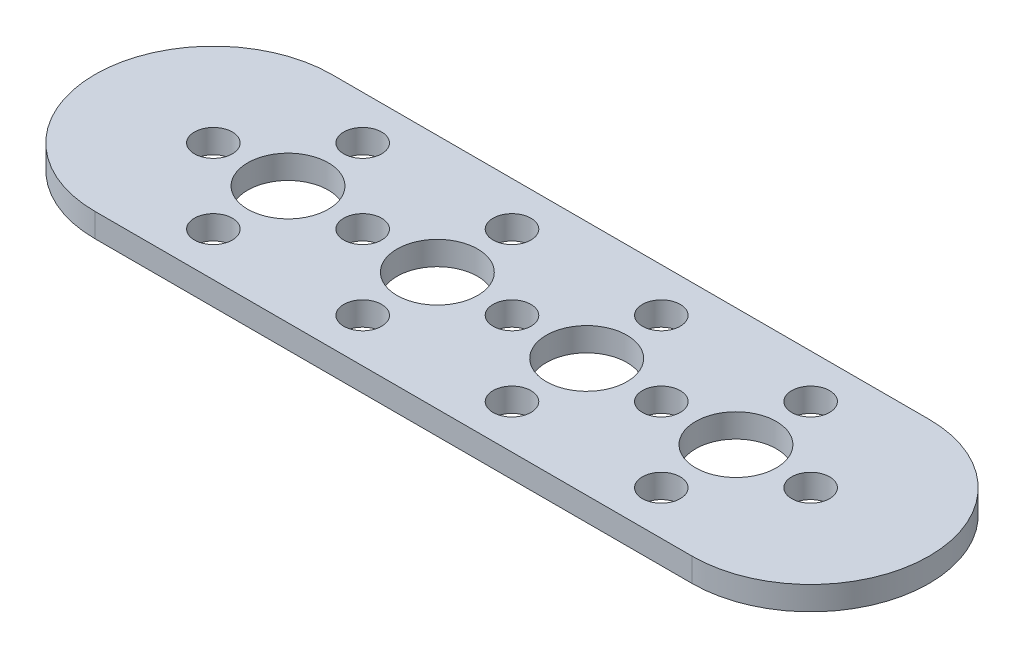
ISO-10303-21;
HEADER;
FILE_DESCRIPTION(('STEP AP214'),'2;1');
FILE_NAME('part.step','',(''),(''),'','','');
FILE_SCHEMA(('AUTOMOTIVE_DESIGN { 1 0 10303 214 1 1 1 1 }'));
ENDSEC;
DATA;
#1=APPLICATION_CONTEXT('core data for automotive mechanical design processes');
#2=APPLICATION_PROTOCOL_DEFINITION('international standard','automotive_design',2000,#1);
#3=PRODUCT_CONTEXT('',#1,'mechanical');
#4=PRODUCT('Part','Part','',(#3));
#5=PRODUCT_RELATED_PRODUCT_CATEGORY('part','',(#4));
#6=PRODUCT_DEFINITION_FORMATION('','',#4);
#7=PRODUCT_DEFINITION_CONTEXT('part definition',#1,'design');
#8=PRODUCT_DEFINITION('design','',#6,#7);
#9=PRODUCT_DEFINITION_SHAPE('','',#8);
#10=(LENGTH_UNIT() NAMED_UNIT(*) SI_UNIT(.MILLI.,.METRE.));
#11=(NAMED_UNIT(*) PLANE_ANGLE_UNIT() SI_UNIT($,.RADIAN.));
#12=(NAMED_UNIT(*) SI_UNIT($,.STERADIAN.) SOLID_ANGLE_UNIT());
#13=UNCERTAINTY_MEASURE_WITH_UNIT(LENGTH_MEASURE(1.E-05),#10,'distance_accuracy_value','');
#14=(GEOMETRIC_REPRESENTATION_CONTEXT(3) GLOBAL_UNCERTAINTY_ASSIGNED_CONTEXT((#13)) GLOBAL_UNIT_ASSIGNED_CONTEXT((#10,
#11,#12)) REPRESENTATION_CONTEXT('',''));
#15=CARTESIAN_POINT('',(0.,0.,0.));
#16=DIRECTION('',(0.,0.,1.));
#17=DIRECTION('',(1.,0.,0.));
#18=AXIS2_PLACEMENT_3D('',#15,#16,#17);
#19=CARTESIAN_POINT('',(56.007,2.54,0.));
#20=DIRECTION('',(0.,-1.,0.));
#21=DIRECTION('',(0.,0.,-1.));
#22=AXIS2_PLACEMENT_3D('',#19,#20,#21);
#23=CYLINDRICAL_SURFACE('',#22,12.7);
#24=CARTESIAN_POINT('',(56.007,0.,0.));
#25=DIRECTION('',(0.,1.,0.));
#26=DIRECTION('',(0.,0.,1.));
#27=AXIS2_PLACEMENT_3D('',#24,#25,#26);
#28=CIRCLE('',#27,12.7);
#29=CARTESIAN_POINT('',(56.007,0.,-12.7));
#30=VERTEX_POINT('',#29);
#31=CARTESIAN_POINT('',(56.007,0.,12.7));
#32=VERTEX_POINT('',#31);
#33=EDGE_CURVE('E148',#30,#32,#28,.F.);
#34=ORIENTED_EDGE('',*,*,#33,.F.);
#35=DIRECTION('',(0.,-1.,0.));
#36=VECTOR('',#35,1.);
#37=CARTESIAN_POINT('',(56.007,2.54,-12.7));
#38=LINE('',#37,#36);
#39=CARTESIAN_POINT('',(56.007,2.54,-12.7));
#40=VERTEX_POINT('',#39);
#41=EDGE_CURVE('E11',#40,#30,#38,.T.);
#42=ORIENTED_EDGE('',*,*,#41,.F.);
#43=CARTESIAN_POINT('',(56.007,2.54,0.));
#44=DIRECTION('',(0.,1.,0.));
#45=DIRECTION('',(0.,0.,1.));
#46=AXIS2_PLACEMENT_3D('',#43,#44,#45);
#47=CIRCLE('',#46,12.7);
#48=CARTESIAN_POINT('',(56.007,2.54,12.7));
#49=VERTEX_POINT('',#48);
#50=EDGE_CURVE('E91',#40,#49,#47,.F.);
#51=ORIENTED_EDGE('',*,*,#50,.T.);
#52=DIRECTION('',(0.,-1.,0.));
#53=VECTOR('',#52,1.);
#54=CARTESIAN_POINT('',(56.007,2.54,12.7));
#55=LINE('',#54,#53);
#56=EDGE_CURVE('E71',#49,#32,#55,.T.);
#57=ORIENTED_EDGE('',*,*,#56,.T.);
#58=EDGE_LOOP('',(#34,#42,#51,#57));
#59=FACE_BOUND('',#58,.T.);
#60=ADVANCED_FACE('F33',(#59),#23,.T.);
#61=CARTESIAN_POINT('',(0.,2.54,-12.7));
#62=DIRECTION('',(0.,0.,-1.));
#63=DIRECTION('',(-1.,0.,0.));
#64=AXIS2_PLACEMENT_3D('',#61,#62,#63);
#65=PLANE('',#64);
#66=DIRECTION('',(1.,0.,0.));
#67=VECTOR('',#66,1.);
#68=CARTESIAN_POINT('',(0.,0.,-12.7));
#69=LINE('',#68,#67);
#70=CARTESIAN_POINT('',(-8.00100000000001,0.,-12.7));
#71=VERTEX_POINT('',#70);
#72=EDGE_CURVE('E84',#71,#30,#69,.T.);
#73=ORIENTED_EDGE('',*,*,#72,.F.);
#74=DIRECTION('',(0.,-1.,0.));
#75=VECTOR('',#74,1.);
#76=CARTESIAN_POINT('',(-8.00100000000001,2.54,-12.7));
#77=LINE('',#76,#75);
#78=CARTESIAN_POINT('',(-8.00100000000001,2.54,-12.7));
#79=VERTEX_POINT('',#78);
#80=EDGE_CURVE('E41',#79,#71,#77,.T.);
#81=ORIENTED_EDGE('',*,*,#80,.F.);
#82=DIRECTION('',(1.,0.,0.));
#83=VECTOR('',#82,1.);
#84=CARTESIAN_POINT('',(0.,2.54,-12.7));
#85=LINE('',#84,#83);
#86=EDGE_CURVE('E82',#79,#40,#85,.T.);
#87=ORIENTED_EDGE('',*,*,#86,.T.);
#88=ORIENTED_EDGE('',*,*,#41,.T.);
#89=EDGE_LOOP('',(#73,#81,#87,#88));
#90=FACE_BOUND('',#89,.T.);
#91=ADVANCED_FACE('F80',(#90),#65,.T.);
#92=CARTESIAN_POINT('',(-8.00100000000001,2.54,0.));
#93=DIRECTION('',(0.,-1.,0.));
#94=DIRECTION('',(0.,0.,-1.));
#95=AXIS2_PLACEMENT_3D('',#92,#93,#94);
#96=CYLINDRICAL_SURFACE('',#95,12.7);
#97=CARTESIAN_POINT('',(-8.00100000000001,0.,0.));
#98=DIRECTION('',(0.,1.,0.));
#99=DIRECTION('',(0.,0.,1.));
#100=AXIS2_PLACEMENT_3D('',#97,#98,#99);
#101=CIRCLE('',#100,12.7);
#102=CARTESIAN_POINT('',(-8.001,0.,12.7));
#103=VERTEX_POINT('',#102);
#104=EDGE_CURVE('E64',#71,#103,#101,.T.);
#105=ORIENTED_EDGE('',*,*,#104,.T.);
#106=DIRECTION('',(0.,-1.,0.));
#107=VECTOR('',#106,1.);
#108=CARTESIAN_POINT('',(-8.001,2.54,12.7));
#109=LINE('',#108,#107);
#110=CARTESIAN_POINT('',(-8.001,2.54,12.7));
#111=VERTEX_POINT('',#110);
#112=EDGE_CURVE('E85',#111,#103,#109,.T.);
#113=ORIENTED_EDGE('',*,*,#112,.F.);
#114=CARTESIAN_POINT('',(-8.00100000000001,2.54,0.));
#115=DIRECTION('',(0.,1.,0.));
#116=DIRECTION('',(0.,0.,1.));
#117=AXIS2_PLACEMENT_3D('',#114,#115,#116);
#118=CIRCLE('',#117,12.7);
#119=EDGE_CURVE('E86',#79,#111,#118,.T.);
#120=ORIENTED_EDGE('',*,*,#119,.F.);
#121=ORIENTED_EDGE('',*,*,#80,.T.);
#122=EDGE_LOOP('',(#105,#113,#120,#121));
#123=FACE_BOUND('',#122,.T.);
#124=ADVANCED_FACE('F87',(#123),#96,.T.);
#125=CARTESIAN_POINT('',(0.,2.54,8.001));
#126=DIRECTION('',(0.,-1.,0.));
#127=DIRECTION('',(0.,0.,-1.));
#128=AXIS2_PLACEMENT_3D('',#125,#126,#127);
#129=CYLINDRICAL_SURFACE('',#128,2.032);
#130=CARTESIAN_POINT('',(0.,2.54,8.001));
#131=DIRECTION('',(0.,1.,0.));
#132=DIRECTION('',(0.,0.,1.));
#133=AXIS2_PLACEMENT_3D('',#130,#131,#132);
#134=CIRCLE('',#133,2.032);
#135=CARTESIAN_POINT('',(0.,2.54,10.033));
#136=VERTEX_POINT('',#135);
#137=EDGE_CURVE('E142',#136,#136,#134,.T.);
#138=ORIENTED_EDGE('',*,*,#137,.T.);
#139=EDGE_LOOP('',(#138));
#140=FACE_BOUND('',#139,.T.);
#141=CARTESIAN_POINT('',(0.,0.,8.001));
#142=DIRECTION('',(0.,1.,0.));
#143=DIRECTION('',(0.,0.,1.));
#144=AXIS2_PLACEMENT_3D('',#141,#142,#143);
#145=CIRCLE('',#144,2.032);
#146=CARTESIAN_POINT('',(0.,0.,10.033));
#147=VERTEX_POINT('',#146);
#148=EDGE_CURVE('E200',#147,#147,#145,.T.);
#149=ORIENTED_EDGE('',*,*,#148,.F.);
#150=EDGE_LOOP('',(#149));
#151=FACE_BOUND('',#150,.T.);
#152=ADVANCED_FACE('F219',(#140,#151),#129,.F.);
#153=CARTESIAN_POINT('',(-8.001,2.54,0.));
#154=DIRECTION('',(0.,-1.,0.));
#155=DIRECTION('',(0.,0.,-1.));
#156=AXIS2_PLACEMENT_3D('',#153,#154,#155);
#157=CYLINDRICAL_SURFACE('',#156,2.03199999999997);
#158=CARTESIAN_POINT('',(-8.001,2.54,0.));
#159=DIRECTION('',(0.,1.,0.));
#160=DIRECTION('',(0.,0.,1.));
#161=AXIS2_PLACEMENT_3D('',#158,#159,#160);
#162=CIRCLE('',#161,2.03199999999997);
#163=CARTESIAN_POINT('',(-8.001,2.54,2.03199999999997));
#164=VERTEX_POINT('',#163);
#165=EDGE_CURVE('E139',#164,#164,#162,.T.);
#166=ORIENTED_EDGE('',*,*,#165,.T.);
#167=EDGE_LOOP('',(#166));
#168=FACE_BOUND('',#167,.T.);
#169=CARTESIAN_POINT('',(-8.001,0.,0.));
#170=DIRECTION('',(0.,1.,0.));
#171=DIRECTION('',(0.,0.,1.));
#172=AXIS2_PLACEMENT_3D('',#169,#170,#171);
#173=CIRCLE('',#172,2.03199999999997);
#174=CARTESIAN_POINT('',(-8.001,0.,2.03199999999997));
#175=VERTEX_POINT('',#174);
#176=EDGE_CURVE('E197',#175,#175,#173,.T.);
#177=ORIENTED_EDGE('',*,*,#176,.F.);
#178=EDGE_LOOP('',(#177));
#179=FACE_BOUND('',#178,.T.);
#180=ADVANCED_FACE('F280',(#168,#179),#157,.F.);
#181=CARTESIAN_POINT('',(0.,2.54,-8.001));
#182=DIRECTION('',(0.,-1.,0.));
#183=DIRECTION('',(0.,0.,-1.));
#184=AXIS2_PLACEMENT_3D('',#181,#182,#183);
#185=CYLINDRICAL_SURFACE('',#184,2.032);
#186=CARTESIAN_POINT('',(0.,2.54,-8.001));
#187=DIRECTION('',(0.,1.,0.));
#188=DIRECTION('',(0.,0.,1.));
#189=AXIS2_PLACEMENT_3D('',#186,#187,#188);
#190=CIRCLE('',#189,2.032);
#191=CARTESIAN_POINT('',(0.,2.54,-5.969));
#192=VERTEX_POINT('',#191);
#193=EDGE_CURVE('E136',#192,#192,#190,.T.);
#194=ORIENTED_EDGE('',*,*,#193,.T.);
#195=EDGE_LOOP('',(#194));
#196=FACE_BOUND('',#195,.T.);
#197=CARTESIAN_POINT('',(0.,0.,-8.001));
#198=DIRECTION('',(0.,1.,0.));
#199=DIRECTION('',(0.,0.,1.));
#200=AXIS2_PLACEMENT_3D('',#197,#198,#199);
#201=CIRCLE('',#200,2.032);
#202=CARTESIAN_POINT('',(0.,0.,-5.969));
#203=VERTEX_POINT('',#202);
#204=EDGE_CURVE('E194',#203,#203,#201,.T.);
#205=ORIENTED_EDGE('',*,*,#204,.F.);
#206=EDGE_LOOP('',(#205));
#207=FACE_BOUND('',#206,.T.);
#208=ADVANCED_FACE('F276',(#196,#207),#185,.F.);
#209=CARTESIAN_POINT('',(8.001,2.54,0.));
#210=DIRECTION('',(0.,-1.,0.));
#211=DIRECTION('',(0.,0.,-1.));
#212=AXIS2_PLACEMENT_3D('',#209,#210,#211);
#213=CYLINDRICAL_SURFACE('',#212,2.03199999999991);
#214=CARTESIAN_POINT('',(8.001,2.54,0.));
#215=DIRECTION('',(0.,1.,0.));
#216=DIRECTION('',(0.,0.,1.));
#217=AXIS2_PLACEMENT_3D('',#214,#215,#216);
#218=CIRCLE('',#217,2.03199999999991);
#219=CARTESIAN_POINT('',(8.001,2.54,2.0319999999999));
#220=VERTEX_POINT('',#219);
#221=EDGE_CURVE('E133',#220,#220,#218,.T.);
#222=ORIENTED_EDGE('',*,*,#221,.T.);
#223=EDGE_LOOP('',(#222));
#224=FACE_BOUND('',#223,.T.);
#225=CARTESIAN_POINT('',(8.001,0.,0.));
#226=DIRECTION('',(0.,1.,0.));
#227=DIRECTION('',(0.,0.,1.));
#228=AXIS2_PLACEMENT_3D('',#225,#226,#227);
#229=CIRCLE('',#228,2.03199999999991);
#230=CARTESIAN_POINT('',(8.001,0.,2.0319999999999));
#231=VERTEX_POINT('',#230);
#232=EDGE_CURVE('E191',#231,#231,#229,.T.);
#233=ORIENTED_EDGE('',*,*,#232,.F.);
#234=EDGE_LOOP('',(#233));
#235=FACE_BOUND('',#234,.T.);
#236=ADVANCED_FACE('F272',(#224,#235),#213,.F.);
#237=CARTESIAN_POINT('',(16.002,2.54,8.001));
#238=DIRECTION('',(0.,-1.,0.));
#239=DIRECTION('',(0.,0.,-1.));
#240=AXIS2_PLACEMENT_3D('',#237,#238,#239);
#241=CYLINDRICAL_SURFACE('',#240,2.032);
#242=CARTESIAN_POINT('',(16.002,2.54,8.001));
#243=DIRECTION('',(0.,1.,0.));
#244=DIRECTION('',(0.,0.,1.));
#245=AXIS2_PLACEMENT_3D('',#242,#243,#244);
#246=CIRCLE('',#245,2.032);
#247=CARTESIAN_POINT('',(16.002,2.54,10.033));
#248=VERTEX_POINT('',#247);
#249=EDGE_CURVE('E130',#248,#248,#246,.T.);
#250=ORIENTED_EDGE('',*,*,#249,.T.);
#251=EDGE_LOOP('',(#250));
#252=FACE_BOUND('',#251,.T.);
#253=CARTESIAN_POINT('',(16.002,0.,8.001));
#254=DIRECTION('',(0.,1.,0.));
#255=DIRECTION('',(0.,0.,1.));
#256=AXIS2_PLACEMENT_3D('',#253,#254,#255);
#257=CIRCLE('',#256,2.032);
#258=CARTESIAN_POINT('',(16.002,0.,10.033));
#259=VERTEX_POINT('',#258);
#260=EDGE_CURVE('E188',#259,#259,#257,.T.);
#261=ORIENTED_EDGE('',*,*,#260,.F.);
#262=EDGE_LOOP('',(#261));
#263=FACE_BOUND('',#262,.T.);
#264=ADVANCED_FACE('F268',(#252,#263),#241,.F.);
#265=CARTESIAN_POINT('',(16.002,2.54,0.));
#266=DIRECTION('',(0.,-1.,0.));
#267=DIRECTION('',(0.,0.,-1.));
#268=AXIS2_PLACEMENT_3D('',#265,#266,#267);
#269=CYLINDRICAL_SURFACE('',#268,4.318);
#270=CARTESIAN_POINT('',(16.002,2.54,0.));
#271=DIRECTION('',(0.,1.,0.));
#272=DIRECTION('',(0.,0.,1.));
#273=AXIS2_PLACEMENT_3D('',#270,#271,#272);
#274=CIRCLE('',#273,4.318);
#275=CARTESIAN_POINT('',(16.002,2.54,4.318));
#276=VERTEX_POINT('',#275);
#277=EDGE_CURVE('E127',#276,#276,#274,.T.);
#278=ORIENTED_EDGE('',*,*,#277,.T.);
#279=EDGE_LOOP('',(#278));
#280=FACE_BOUND('',#279,.T.);
#281=CARTESIAN_POINT('',(16.002,0.,0.));
#282=DIRECTION('',(0.,1.,0.));
#283=DIRECTION('',(0.,0.,1.));
#284=AXIS2_PLACEMENT_3D('',#281,#282,#283);
#285=CIRCLE('',#284,4.318);
#286=CARTESIAN_POINT('',(16.002,0.,4.318));
#287=VERTEX_POINT('',#286);
#288=EDGE_CURVE('E185',#287,#287,#285,.T.);
#289=ORIENTED_EDGE('',*,*,#288,.F.);
#290=EDGE_LOOP('',(#289));
#291=FACE_BOUND('',#290,.T.);
#292=ADVANCED_FACE('F264',(#280,#291),#269,.F.);
#293=CARTESIAN_POINT('',(24.003,2.54,0.));
#294=DIRECTION('',(0.,-1.,0.));
#295=DIRECTION('',(0.,0.,-1.));
#296=AXIS2_PLACEMENT_3D('',#293,#294,#295);
#297=CYLINDRICAL_SURFACE('',#296,2.032);
#298=CARTESIAN_POINT('',(24.003,2.54,0.));
#299=DIRECTION('',(0.,1.,0.));
#300=DIRECTION('',(0.,0.,1.));
#301=AXIS2_PLACEMENT_3D('',#298,#299,#300);
#302=CIRCLE('',#301,2.032);
#303=CARTESIAN_POINT('',(24.003,2.54,2.03200000000008));
#304=VERTEX_POINT('',#303);
#305=EDGE_CURVE('E124',#304,#304,#302,.T.);
#306=ORIENTED_EDGE('',*,*,#305,.T.);
#307=EDGE_LOOP('',(#306));
#308=FACE_BOUND('',#307,.T.);
#309=CARTESIAN_POINT('',(24.003,0.,0.));
#310=DIRECTION('',(0.,1.,0.));
#311=DIRECTION('',(0.,0.,1.));
#312=AXIS2_PLACEMENT_3D('',#309,#310,#311);
#313=CIRCLE('',#312,2.032);
#314=CARTESIAN_POINT('',(24.003,0.,2.03200000000008));
#315=VERTEX_POINT('',#314);
#316=EDGE_CURVE('E182',#315,#315,#313,.T.);
#317=ORIENTED_EDGE('',*,*,#316,.F.);
#318=EDGE_LOOP('',(#317));
#319=FACE_BOUND('',#318,.T.);
#320=ADVANCED_FACE('F260',(#308,#319),#297,.F.);
#321=CARTESIAN_POINT('',(16.0020000000001,2.54,-8.001));
#322=DIRECTION('',(0.,-1.,0.));
#323=DIRECTION('',(0.,0.,-1.));
#324=AXIS2_PLACEMENT_3D('',#321,#322,#323);
#325=CYLINDRICAL_SURFACE('',#324,2.032);
#326=CARTESIAN_POINT('',(16.0020000000001,2.54,-8.001));
#327=DIRECTION('',(0.,1.,0.));
#328=DIRECTION('',(0.,0.,1.));
#329=AXIS2_PLACEMENT_3D('',#326,#327,#328);
#330=CIRCLE('',#329,2.032);
#331=CARTESIAN_POINT('',(16.0020000000001,2.54,-5.969));
#332=VERTEX_POINT('',#331);
#333=EDGE_CURVE('E121',#332,#332,#330,.T.);
#334=ORIENTED_EDGE('',*,*,#333,.T.);
#335=EDGE_LOOP('',(#334));
#336=FACE_BOUND('',#335,.T.);
#337=CARTESIAN_POINT('',(16.0020000000001,0.,-8.001));
#338=DIRECTION('',(0.,1.,0.));
#339=DIRECTION('',(0.,0.,1.));
#340=AXIS2_PLACEMENT_3D('',#337,#338,#339);
#341=CIRCLE('',#340,2.032);
#342=CARTESIAN_POINT('',(16.0020000000001,0.,-5.969));
#343=VERTEX_POINT('',#342);
#344=EDGE_CURVE('E179',#343,#343,#341,.T.);
#345=ORIENTED_EDGE('',*,*,#344,.F.);
#346=EDGE_LOOP('',(#345));
#347=FACE_BOUND('',#346,.T.);
#348=ADVANCED_FACE('F256',(#336,#347),#325,.F.);
#349=CARTESIAN_POINT('',(32.004,2.54,8.001));
#350=DIRECTION('',(0.,-1.,0.));
#351=DIRECTION('',(0.,0.,-1.));
#352=AXIS2_PLACEMENT_3D('',#349,#350,#351);
#353=CYLINDRICAL_SURFACE('',#352,2.032);
#354=CARTESIAN_POINT('',(32.004,2.54,8.001));
#355=DIRECTION('',(0.,1.,0.));
#356=DIRECTION('',(0.,0.,1.));
#357=AXIS2_PLACEMENT_3D('',#354,#355,#356);
#358=CIRCLE('',#357,2.032);
#359=CARTESIAN_POINT('',(32.004,2.54,10.033));
#360=VERTEX_POINT('',#359);
#361=EDGE_CURVE('E118',#360,#360,#358,.T.);
#362=ORIENTED_EDGE('',*,*,#361,.T.);
#363=EDGE_LOOP('',(#362));
#364=FACE_BOUND('',#363,.T.);
#365=CARTESIAN_POINT('',(32.004,0.,8.001));
#366=DIRECTION('',(0.,1.,0.));
#367=DIRECTION('',(0.,0.,1.));
#368=AXIS2_PLACEMENT_3D('',#365,#366,#367);
#369=CIRCLE('',#368,2.032);
#370=CARTESIAN_POINT('',(32.004,0.,10.033));
#371=VERTEX_POINT('',#370);
#372=EDGE_CURVE('E176',#371,#371,#369,.T.);
#373=ORIENTED_EDGE('',*,*,#372,.F.);
#374=EDGE_LOOP('',(#373));
#375=FACE_BOUND('',#374,.T.);
#376=ADVANCED_FACE('F252',(#364,#375),#353,.F.);
#377=CARTESIAN_POINT('',(32.004,2.54,0.));
#378=DIRECTION('',(0.,-1.,0.));
#379=DIRECTION('',(0.,0.,-1.));
#380=AXIS2_PLACEMENT_3D('',#377,#378,#379);
#381=CYLINDRICAL_SURFACE('',#380,4.318);
#382=CARTESIAN_POINT('',(32.004,2.54,0.));
#383=DIRECTION('',(0.,1.,0.));
#384=DIRECTION('',(0.,0.,1.));
#385=AXIS2_PLACEMENT_3D('',#382,#383,#384);
#386=CIRCLE('',#385,4.318);
#387=CARTESIAN_POINT('',(32.004,2.54,4.318));
#388=VERTEX_POINT('',#387);
#389=EDGE_CURVE('E115',#388,#388,#386,.T.);
#390=ORIENTED_EDGE('',*,*,#389,.T.);
#391=EDGE_LOOP('',(#390));
#392=FACE_BOUND('',#391,.T.);
#393=CARTESIAN_POINT('',(32.004,0.,0.));
#394=DIRECTION('',(0.,1.,0.));
#395=DIRECTION('',(0.,0.,1.));
#396=AXIS2_PLACEMENT_3D('',#393,#394,#395);
#397=CIRCLE('',#396,4.318);
#398=CARTESIAN_POINT('',(32.004,0.,4.318));
#399=VERTEX_POINT('',#398);
#400=EDGE_CURVE('E173',#399,#399,#397,.T.);
#401=ORIENTED_EDGE('',*,*,#400,.F.);
#402=EDGE_LOOP('',(#401));
#403=FACE_BOUND('',#402,.T.);
#404=ADVANCED_FACE('F248',(#392,#403),#381,.F.);
#405=CARTESIAN_POINT('',(40.005,2.54,0.));
#406=DIRECTION('',(0.,-1.,0.));
#407=DIRECTION('',(0.,0.,-1.));
#408=AXIS2_PLACEMENT_3D('',#405,#406,#407);
#409=CYLINDRICAL_SURFACE('',#408,2.032);
#410=CARTESIAN_POINT('',(40.005,2.54,0.));
#411=DIRECTION('',(0.,1.,0.));
#412=DIRECTION('',(0.,0.,1.));
#413=AXIS2_PLACEMENT_3D('',#410,#411,#412);
#414=CIRCLE('',#413,2.032);
#415=CARTESIAN_POINT('',(40.005,2.54,2.03200000000008));
#416=VERTEX_POINT('',#415);
#417=EDGE_CURVE('E112',#416,#416,#414,.T.);
#418=ORIENTED_EDGE('',*,*,#417,.T.);
#419=EDGE_LOOP('',(#418));
#420=FACE_BOUND('',#419,.T.);
#421=CARTESIAN_POINT('',(40.005,0.,0.));
#422=DIRECTION('',(0.,1.,0.));
#423=DIRECTION('',(0.,0.,1.));
#424=AXIS2_PLACEMENT_3D('',#421,#422,#423);
#425=CIRCLE('',#424,2.032);
#426=CARTESIAN_POINT('',(40.005,0.,2.03200000000008));
#427=VERTEX_POINT('',#426);
#428=EDGE_CURVE('E170',#427,#427,#425,.T.);
#429=ORIENTED_EDGE('',*,*,#428,.F.);
#430=EDGE_LOOP('',(#429));
#431=FACE_BOUND('',#430,.T.);
#432=ADVANCED_FACE('F244',(#420,#431),#409,.F.);
#433=CARTESIAN_POINT('',(32.0040000000001,2.54,-8.001));
#434=DIRECTION('',(0.,-1.,0.));
#435=DIRECTION('',(0.,0.,-1.));
#436=AXIS2_PLACEMENT_3D('',#433,#434,#435);
#437=CYLINDRICAL_SURFACE('',#436,2.032);
#438=CARTESIAN_POINT('',(32.0040000000001,2.54,-8.001));
#439=DIRECTION('',(0.,1.,0.));
#440=DIRECTION('',(0.,0.,1.));
#441=AXIS2_PLACEMENT_3D('',#438,#439,#440);
#442=CIRCLE('',#441,2.032);
#443=CARTESIAN_POINT('',(32.0040000000001,2.54,-5.969));
#444=VERTEX_POINT('',#443);
#445=EDGE_CURVE('E109',#444,#444,#442,.T.);
#446=ORIENTED_EDGE('',*,*,#445,.T.);
#447=EDGE_LOOP('',(#446));
#448=FACE_BOUND('',#447,.T.);
#449=CARTESIAN_POINT('',(32.0040000000001,0.,-8.001));
#450=DIRECTION('',(0.,1.,0.));
#451=DIRECTION('',(0.,0.,1.));
#452=AXIS2_PLACEMENT_3D('',#449,#450,#451);
#453=CIRCLE('',#452,2.032);
#454=CARTESIAN_POINT('',(32.0040000000001,0.,-5.969));
#455=VERTEX_POINT('',#454);
#456=EDGE_CURVE('E167',#455,#455,#453,.T.);
#457=ORIENTED_EDGE('',*,*,#456,.F.);
#458=EDGE_LOOP('',(#457));
#459=FACE_BOUND('',#458,.T.);
#460=ADVANCED_FACE('F240',(#448,#459),#437,.F.);
#461=CARTESIAN_POINT('',(48.006,2.54,8.001));
#462=DIRECTION('',(0.,-1.,0.));
#463=DIRECTION('',(0.,0.,-1.));
#464=AXIS2_PLACEMENT_3D('',#461,#462,#463);
#465=CYLINDRICAL_SURFACE('',#464,2.032);
#466=CARTESIAN_POINT('',(48.006,2.54,8.001));
#467=DIRECTION('',(0.,1.,0.));
#468=DIRECTION('',(0.,0.,1.));
#469=AXIS2_PLACEMENT_3D('',#466,#467,#468);
#470=CIRCLE('',#469,2.032);
#471=CARTESIAN_POINT('',(48.006,2.54,10.033));
#472=VERTEX_POINT('',#471);
#473=EDGE_CURVE('E106',#472,#472,#470,.T.);
#474=ORIENTED_EDGE('',*,*,#473,.T.);
#475=EDGE_LOOP('',(#474));
#476=FACE_BOUND('',#475,.T.);
#477=CARTESIAN_POINT('',(48.006,0.,8.001));
#478=DIRECTION('',(0.,1.,0.));
#479=DIRECTION('',(0.,0.,1.));
#480=AXIS2_PLACEMENT_3D('',#477,#478,#479);
#481=CIRCLE('',#480,2.032);
#482=CARTESIAN_POINT('',(48.006,0.,10.033));
#483=VERTEX_POINT('',#482);
#484=EDGE_CURVE('E164',#483,#483,#481,.T.);
#485=ORIENTED_EDGE('',*,*,#484,.F.);
#486=EDGE_LOOP('',(#485));
#487=FACE_BOUND('',#486,.T.);
#488=ADVANCED_FACE('F236',(#476,#487),#465,.F.);
#489=CARTESIAN_POINT('',(48.006,2.54,0.));
#490=DIRECTION('',(0.,-1.,0.));
#491=DIRECTION('',(0.,0.,-1.));
#492=AXIS2_PLACEMENT_3D('',#489,#490,#491);
#493=CYLINDRICAL_SURFACE('',#492,4.318);
#494=CARTESIAN_POINT('',(48.006,2.54,0.));
#495=DIRECTION('',(0.,1.,0.));
#496=DIRECTION('',(0.,0.,1.));
#497=AXIS2_PLACEMENT_3D('',#494,#495,#496);
#498=CIRCLE('',#497,4.318);
#499=CARTESIAN_POINT('',(48.006,2.54,4.318));
#500=VERTEX_POINT('',#499);
#501=EDGE_CURVE('E103',#500,#500,#498,.T.);
#502=ORIENTED_EDGE('',*,*,#501,.T.);
#503=EDGE_LOOP('',(#502));
#504=FACE_BOUND('',#503,.T.);
#505=CARTESIAN_POINT('',(48.006,0.,0.));
#506=DIRECTION('',(0.,1.,0.));
#507=DIRECTION('',(0.,0.,1.));
#508=AXIS2_PLACEMENT_3D('',#505,#506,#507);
#509=CIRCLE('',#508,4.318);
#510=CARTESIAN_POINT('',(48.006,0.,4.318));
#511=VERTEX_POINT('',#510);
#512=EDGE_CURVE('E161',#511,#511,#509,.T.);
#513=ORIENTED_EDGE('',*,*,#512,.F.);
#514=EDGE_LOOP('',(#513));
#515=FACE_BOUND('',#514,.T.);
#516=ADVANCED_FACE('F232',(#504,#515),#493,.F.);
#517=CARTESIAN_POINT('',(56.007,2.54,0.));
#518=DIRECTION('',(0.,-1.,0.));
#519=DIRECTION('',(0.,0.,-1.));
#520=AXIS2_PLACEMENT_3D('',#517,#518,#519);
#521=CYLINDRICAL_SURFACE('',#520,2.032);
#522=CARTESIAN_POINT('',(56.007,2.54,0.));
#523=DIRECTION('',(0.,1.,0.));
#524=DIRECTION('',(0.,0.,1.));
#525=AXIS2_PLACEMENT_3D('',#522,#523,#524);
#526=CIRCLE('',#525,2.032);
#527=CARTESIAN_POINT('',(56.007,2.54,2.03200000000008));
#528=VERTEX_POINT('',#527);
#529=EDGE_CURVE('E100',#528,#528,#526,.T.);
#530=ORIENTED_EDGE('',*,*,#529,.T.);
#531=EDGE_LOOP('',(#530));
#532=FACE_BOUND('',#531,.T.);
#533=CARTESIAN_POINT('',(56.007,0.,0.));
#534=DIRECTION('',(0.,1.,0.));
#535=DIRECTION('',(0.,0.,1.));
#536=AXIS2_PLACEMENT_3D('',#533,#534,#535);
#537=CIRCLE('',#536,2.032);
#538=CARTESIAN_POINT('',(56.007,0.,2.03200000000008));
#539=VERTEX_POINT('',#538);
#540=EDGE_CURVE('E158',#539,#539,#537,.T.);
#541=ORIENTED_EDGE('',*,*,#540,.F.);
#542=EDGE_LOOP('',(#541));
#543=FACE_BOUND('',#542,.T.);
#544=ADVANCED_FACE('F228',(#532,#543),#521,.F.);
#545=CARTESIAN_POINT('',(48.006,2.54,-8.001));
#546=DIRECTION('',(0.,-1.,0.));
#547=DIRECTION('',(0.,0.,-1.));
#548=AXIS2_PLACEMENT_3D('',#545,#546,#547);
#549=CYLINDRICAL_SURFACE('',#548,2.032);
#550=CARTESIAN_POINT('',(48.006,2.54,-8.001));
#551=DIRECTION('',(0.,1.,0.));
#552=DIRECTION('',(0.,0.,1.));
#553=AXIS2_PLACEMENT_3D('',#550,#551,#552);
#554=CIRCLE('',#553,2.032);
#555=CARTESIAN_POINT('',(48.006,2.54,-5.969));
#556=VERTEX_POINT('',#555);
#557=EDGE_CURVE('E97',#556,#556,#554,.T.);
#558=ORIENTED_EDGE('',*,*,#557,.T.);
#559=EDGE_LOOP('',(#558));
#560=FACE_BOUND('',#559,.T.);
#561=CARTESIAN_POINT('',(48.006,0.,-8.001));
#562=DIRECTION('',(0.,1.,0.));
#563=DIRECTION('',(0.,0.,1.));
#564=AXIS2_PLACEMENT_3D('',#561,#562,#563);
#565=CIRCLE('',#564,2.032);
#566=CARTESIAN_POINT('',(48.006,0.,-5.969));
#567=VERTEX_POINT('',#566);
#568=EDGE_CURVE('E155',#567,#567,#565,.T.);
#569=ORIENTED_EDGE('',*,*,#568,.F.);
#570=EDGE_LOOP('',(#569));
#571=FACE_BOUND('',#570,.T.);
#572=ADVANCED_FACE('F225',(#560,#571),#549,.F.);
#573=CARTESIAN_POINT('',(0.,2.54,12.7));
#574=DIRECTION('',(0.,0.,-1.));
#575=DIRECTION('',(-1.,0.,0.));
#576=AXIS2_PLACEMENT_3D('',#573,#574,#575);
#577=PLANE('',#576);
#578=DIRECTION('',(1.,0.,0.));
#579=VECTOR('',#578,1.);
#580=CARTESIAN_POINT('',(0.,0.,12.7));
#581=LINE('',#580,#579);
#582=EDGE_CURVE('E153',#103,#32,#581,.T.);
#583=ORIENTED_EDGE('',*,*,#582,.T.);
#584=ORIENTED_EDGE('',*,*,#56,.F.);
#585=DIRECTION('',(1.,0.,0.));
#586=VECTOR('',#585,1.);
#587=CARTESIAN_POINT('',(0.,2.54,12.7));
#588=LINE('',#587,#586);
#589=EDGE_CURVE('E49',#111,#49,#588,.T.);
#590=ORIENTED_EDGE('',*,*,#589,.F.);
#591=ORIENTED_EDGE('',*,*,#112,.T.);
#592=EDGE_LOOP('',(#583,#584,#590,#591));
#593=FACE_BOUND('',#592,.T.);
#594=ADVANCED_FACE('F208',(#593),#577,.F.);
#595=CARTESIAN_POINT('',(0.,2.54,0.));
#596=DIRECTION('',(0.,-1.,0.));
#597=DIRECTION('',(0.,0.,-1.));
#598=AXIS2_PLACEMENT_3D('',#595,#596,#597);
#599=CYLINDRICAL_SURFACE('',#598,4.318);
#600=CARTESIAN_POINT('',(0.,2.54,0.));
#601=DIRECTION('',(0.,1.,0.));
#602=DIRECTION('',(0.,0.,1.));
#603=AXIS2_PLACEMENT_3D('',#600,#601,#602);
#604=CIRCLE('',#603,4.318);
#605=CARTESIAN_POINT('',(0.,2.54,4.318));
#606=VERTEX_POINT('',#605);
#607=EDGE_CURVE('E145',#606,#606,#604,.T.);
#608=ORIENTED_EDGE('',*,*,#607,.T.);
#609=EDGE_LOOP('',(#608));
#610=FACE_BOUND('',#609,.T.);
#611=CARTESIAN_POINT('',(0.,0.,0.));
#612=DIRECTION('',(0.,1.,0.));
#613=DIRECTION('',(0.,0.,1.));
#614=AXIS2_PLACEMENT_3D('',#611,#612,#613);
#615=CIRCLE('',#614,4.318);
#616=CARTESIAN_POINT('',(0.,0.,4.318));
#617=VERTEX_POINT('',#616);
#618=EDGE_CURVE('E93',#617,#617,#615,.T.);
#619=ORIENTED_EDGE('',*,*,#618,.F.);
#620=EDGE_LOOP('',(#619));
#621=FACE_BOUND('',#620,.T.);
#622=ADVANCED_FACE('F224',(#610,#621),#599,.F.);
#623=CARTESIAN_POINT('',(0.,2.54,0.));
#624=DIRECTION('',(0.,1.,0.));
#625=DIRECTION('',(0.,0.,1.));
#626=AXIS2_PLACEMENT_3D('',#623,#624,#625);
#627=PLANE('',#626);
#628=ORIENTED_EDGE('',*,*,#50,.F.);
#629=ORIENTED_EDGE('',*,*,#86,.F.);
#630=ORIENTED_EDGE('',*,*,#119,.T.);
#631=ORIENTED_EDGE('',*,*,#589,.T.);
#632=EDGE_LOOP('',(#628,#629,#630,#631));
#633=FACE_BOUND('',#632,.T.);
#634=ORIENTED_EDGE('',*,*,#557,.F.);
#635=EDGE_LOOP('',(#634));
#636=FACE_BOUND('',#635,.T.);
#637=ORIENTED_EDGE('',*,*,#529,.F.);
#638=EDGE_LOOP('',(#637));
#639=FACE_BOUND('',#638,.T.);
#640=ORIENTED_EDGE('',*,*,#501,.F.);
#641=EDGE_LOOP('',(#640));
#642=FACE_BOUND('',#641,.T.);
#643=ORIENTED_EDGE('',*,*,#473,.F.);
#644=EDGE_LOOP('',(#643));
#645=FACE_BOUND('',#644,.T.);
#646=ORIENTED_EDGE('',*,*,#445,.F.);
#647=EDGE_LOOP('',(#646));
#648=FACE_BOUND('',#647,.T.);
#649=ORIENTED_EDGE('',*,*,#417,.F.);
#650=EDGE_LOOP('',(#649));
#651=FACE_BOUND('',#650,.T.);
#652=ORIENTED_EDGE('',*,*,#389,.F.);
#653=EDGE_LOOP('',(#652));
#654=FACE_BOUND('',#653,.T.);
#655=ORIENTED_EDGE('',*,*,#361,.F.);
#656=EDGE_LOOP('',(#655));
#657=FACE_BOUND('',#656,.T.);
#658=ORIENTED_EDGE('',*,*,#333,.F.);
#659=EDGE_LOOP('',(#658));
#660=FACE_BOUND('',#659,.T.);
#661=ORIENTED_EDGE('',*,*,#305,.F.);
#662=EDGE_LOOP('',(#661));
#663=FACE_BOUND('',#662,.T.);
#664=ORIENTED_EDGE('',*,*,#277,.F.);
#665=EDGE_LOOP('',(#664));
#666=FACE_BOUND('',#665,.T.);
#667=ORIENTED_EDGE('',*,*,#249,.F.);
#668=EDGE_LOOP('',(#667));
#669=FACE_BOUND('',#668,.T.);
#670=ORIENTED_EDGE('',*,*,#221,.F.);
#671=EDGE_LOOP('',(#670));
#672=FACE_BOUND('',#671,.T.);
#673=ORIENTED_EDGE('',*,*,#193,.F.);
#674=EDGE_LOOP('',(#673));
#675=FACE_BOUND('',#674,.T.);
#676=ORIENTED_EDGE('',*,*,#165,.F.);
#677=EDGE_LOOP('',(#676));
#678=FACE_BOUND('',#677,.T.);
#679=ORIENTED_EDGE('',*,*,#137,.F.);
#680=EDGE_LOOP('',(#679));
#681=FACE_BOUND('',#680,.T.);
#682=ORIENTED_EDGE('',*,*,#607,.F.);
#683=EDGE_LOOP('',(#682));
#684=FACE_BOUND('',#683,.T.);
#685=ADVANCED_FACE('F89',(#633,#636,#639,#642,#645,#648,#651,#654,#657,#660,#663,#666,#669,#672,
#675,#678,#681,#684),#627,.T.);
#686=CARTESIAN_POINT('',(0.,0.,0.));
#687=DIRECTION('',(0.,1.,0.));
#688=DIRECTION('',(0.,0.,1.));
#689=AXIS2_PLACEMENT_3D('',#686,#687,#688);
#690=PLANE('',#689);
#691=ORIENTED_EDGE('',*,*,#33,.T.);
#692=ORIENTED_EDGE('',*,*,#582,.F.);
#693=ORIENTED_EDGE('',*,*,#104,.F.);
#694=ORIENTED_EDGE('',*,*,#72,.T.);
#695=EDGE_LOOP('',(#691,#692,#693,#694));
#696=FACE_BOUND('',#695,.T.);
#697=ORIENTED_EDGE('',*,*,#568,.T.);
#698=EDGE_LOOP('',(#697));
#699=FACE_BOUND('',#698,.T.);
#700=ORIENTED_EDGE('',*,*,#540,.T.);
#701=EDGE_LOOP('',(#700));
#702=FACE_BOUND('',#701,.T.);
#703=ORIENTED_EDGE('',*,*,#512,.T.);
#704=EDGE_LOOP('',(#703));
#705=FACE_BOUND('',#704,.T.);
#706=ORIENTED_EDGE('',*,*,#484,.T.);
#707=EDGE_LOOP('',(#706));
#708=FACE_BOUND('',#707,.T.);
#709=ORIENTED_EDGE('',*,*,#456,.T.);
#710=EDGE_LOOP('',(#709));
#711=FACE_BOUND('',#710,.T.);
#712=ORIENTED_EDGE('',*,*,#428,.T.);
#713=EDGE_LOOP('',(#712));
#714=FACE_BOUND('',#713,.T.);
#715=ORIENTED_EDGE('',*,*,#400,.T.);
#716=EDGE_LOOP('',(#715));
#717=FACE_BOUND('',#716,.T.);
#718=ORIENTED_EDGE('',*,*,#372,.T.);
#719=EDGE_LOOP('',(#718));
#720=FACE_BOUND('',#719,.T.);
#721=ORIENTED_EDGE('',*,*,#344,.T.);
#722=EDGE_LOOP('',(#721));
#723=FACE_BOUND('',#722,.T.);
#724=ORIENTED_EDGE('',*,*,#316,.T.);
#725=EDGE_LOOP('',(#724));
#726=FACE_BOUND('',#725,.T.);
#727=ORIENTED_EDGE('',*,*,#288,.T.);
#728=EDGE_LOOP('',(#727));
#729=FACE_BOUND('',#728,.T.);
#730=ORIENTED_EDGE('',*,*,#260,.T.);
#731=EDGE_LOOP('',(#730));
#732=FACE_BOUND('',#731,.T.);
#733=ORIENTED_EDGE('',*,*,#232,.T.);
#734=EDGE_LOOP('',(#733));
#735=FACE_BOUND('',#734,.T.);
#736=ORIENTED_EDGE('',*,*,#204,.T.);
#737=EDGE_LOOP('',(#736));
#738=FACE_BOUND('',#737,.T.);
#739=ORIENTED_EDGE('',*,*,#176,.T.);
#740=EDGE_LOOP('',(#739));
#741=FACE_BOUND('',#740,.T.);
#742=ORIENTED_EDGE('',*,*,#148,.T.);
#743=EDGE_LOOP('',(#742));
#744=FACE_BOUND('',#743,.T.);
#745=ORIENTED_EDGE('',*,*,#618,.T.);
#746=EDGE_LOOP('',(#745));
#747=FACE_BOUND('',#746,.T.);
#748=ADVANCED_FACE('F210',(#696,#699,#702,#705,#708,#711,#714,#717,#720,#723,#726,#729,#732,
#735,#738,#741,#744,#747),#690,.F.);
#749=CLOSED_SHELL('',(#60,#91,#124,#152,#180,#208,#236,#264,#292,#320,#348,#376,#404,#432,#460,
#488,#516,#544,#572,#594,#622,#685,#748));
#750=MANIFOLD_SOLID_BREP('B2',#749);
#751=ADVANCED_BREP_SHAPE_REPRESENTATION('',(#18,#750),#14);
#752=SHAPE_DEFINITION_REPRESENTATION(#9,#751);
ENDSEC;
END-ISO-10303-21;
